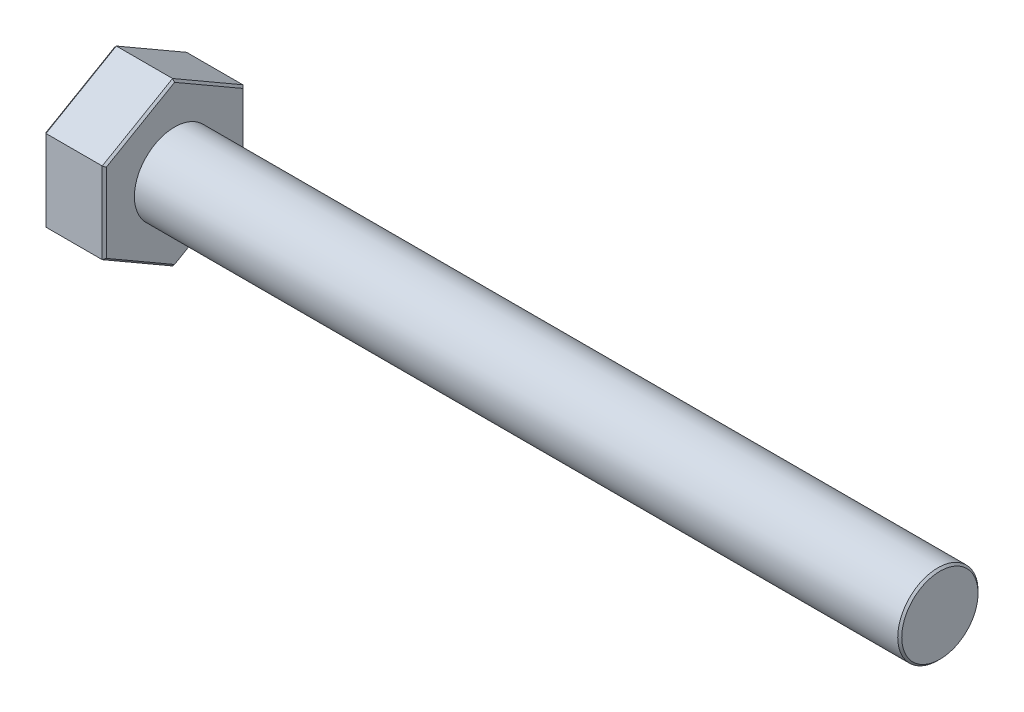
ISO-10303-21;
HEADER;
FILE_DESCRIPTION(('STEP AP214'),'2;1');
FILE_NAME('part.step','',(''),(''),'','','');
FILE_SCHEMA(('AUTOMOTIVE_DESIGN { 1 0 10303 214 1 1 1 1 }'));
ENDSEC;
DATA;
#1=APPLICATION_CONTEXT('core data for automotive mechanical design processes');
#2=APPLICATION_PROTOCOL_DEFINITION('international standard','automotive_design',2000,#1);
#3=PRODUCT_CONTEXT('',#1,'mechanical');
#4=PRODUCT('Part','Part','',(#3));
#5=PRODUCT_RELATED_PRODUCT_CATEGORY('part','',(#4));
#6=PRODUCT_DEFINITION_FORMATION('','',#4);
#7=PRODUCT_DEFINITION_CONTEXT('part definition',#1,'design');
#8=PRODUCT_DEFINITION('design','',#6,#7);
#9=PRODUCT_DEFINITION_SHAPE('','',#8);
#10=(LENGTH_UNIT() NAMED_UNIT(*) SI_UNIT(.MILLI.,.METRE.));
#11=(NAMED_UNIT(*) PLANE_ANGLE_UNIT() SI_UNIT($,.RADIAN.));
#12=(NAMED_UNIT(*) SI_UNIT($,.STERADIAN.) SOLID_ANGLE_UNIT());
#13=UNCERTAINTY_MEASURE_WITH_UNIT(LENGTH_MEASURE(1.E-05),#10,'distance_accuracy_value','');
#14=(GEOMETRIC_REPRESENTATION_CONTEXT(3) GLOBAL_UNCERTAINTY_ASSIGNED_CONTEXT((#13)) GLOBAL_UNIT_ASSIGNED_CONTEXT((#10,
#11,#12)) REPRESENTATION_CONTEXT('',''));
#15=CARTESIAN_POINT('',(0.,0.,0.));
#16=DIRECTION('',(0.,0.,1.));
#17=DIRECTION('',(1.,0.,0.));
#18=AXIS2_PLACEMENT_3D('',#15,#16,#17);
#19=CARTESIAN_POINT('',(-15.5546933939051,0.,0.));
#20=DIRECTION('',(-1.,0.,0.));
#21=DIRECTION('',(0.,0.,1.));
#22=AXIS2_PLACEMENT_3D('',#19,#20,#21);
#23=CYLINDRICAL_SURFACE('',#22,2.);
#24=CARTESIAN_POINT('',(38.,0.,0.));
#25=DIRECTION('',(-1.,0.,0.));
#26=DIRECTION('',(0.,0.,1.));
#27=AXIS2_PLACEMENT_3D('',#24,#25,#26);
#28=CIRCLE('',#27,2.);
#29=CARTESIAN_POINT('',(38.,0.,2.));
#30=VERTEX_POINT('',#29);
#31=EDGE_CURVE('E47',#30,#30,#28,.T.);
#32=ORIENTED_EDGE('',*,*,#31,.T.);
#33=EDGE_LOOP('',(#32));
#34=FACE_BOUND('',#33,.T.);
#35=CARTESIAN_POINT('',(0.,0.,0.));
#36=DIRECTION('',(-1.,0.,0.));
#37=DIRECTION('',(0.,0.,1.));
#38=AXIS2_PLACEMENT_3D('',#35,#36,#37);
#39=CIRCLE('',#38,2.);
#40=CARTESIAN_POINT('',(0.,0.,2.));
#41=VERTEX_POINT('',#40);
#42=EDGE_CURVE('E149',#41,#41,#39,.T.);
#43=ORIENTED_EDGE('',*,*,#42,.F.);
#44=EDGE_LOOP('',(#43));
#45=FACE_BOUND('',#44,.T.);
#46=ADVANCED_FACE('F39',(#34,#45),#23,.T.);
#47=CARTESIAN_POINT('',(38.1,2.,0.));
#48=DIRECTION('',(-1.,0.,0.));
#49=DIRECTION('',(0.,0.,1.));
#50=AXIS2_PLACEMENT_3D('',#47,#48,#49);
#51=PLANE('',#50);
#52=CARTESIAN_POINT('',(38.1,0.,0.));
#53=DIRECTION('',(-1.,0.,0.));
#54=DIRECTION('',(0.,0.,1.));
#55=AXIS2_PLACEMENT_3D('',#52,#53,#54);
#56=CIRCLE('',#55,1.9);
#57=CARTESIAN_POINT('',(38.1,0.,1.9));
#58=VERTEX_POINT('',#57);
#59=EDGE_CURVE('E11',#58,#58,#56,.F.);
#60=ORIENTED_EDGE('',*,*,#59,.T.);
#61=EDGE_LOOP('',(#60));
#62=FACE_BOUND('',#61,.T.);
#63=ADVANCED_FACE('F236',(#62),#51,.F.);
#64=CARTESIAN_POINT('',(0.,4.04145188432738,0.));
#65=DIRECTION('',(-1.,0.,0.));
#66=DIRECTION('',(0.,0.,1.));
#67=AXIS2_PLACEMENT_3D('',#64,#65,#66);
#68=PLANE('',#67);
#69=DIRECTION('',(0.,-0.5,-0.866025403784439));
#70=VECTOR('',#69,1.);
#71=CARTESIAN_POINT('',(0.,-1.93412340178525,3.45));
#72=LINE('',#71,#70);
#73=CARTESIAN_POINT('',(0.,-1.96299091524473,3.4));
#74=VERTEX_POINT('',#73);
#75=CARTESIAN_POINT('',(0.,-3.92598183048946,0.));
#76=VERTEX_POINT('',#75);
#77=EDGE_CURVE('E54',#74,#76,#72,.T.);
#78=ORIENTED_EDGE('',*,*,#77,.T.);
#79=DIRECTION('',(0.,0.5,-0.866025403784439));
#80=VECTOR('',#79,1.);
#81=CARTESIAN_POINT('',(0.,-1.93412340178525,-3.45));
#82=LINE('',#81,#80);
#83=CARTESIAN_POINT('',(0.,-1.96299091524473,-3.4));
#84=VERTEX_POINT('',#83);
#85=EDGE_CURVE('E192',#76,#84,#82,.T.);
#86=ORIENTED_EDGE('',*,*,#85,.T.);
#87=DIRECTION('',(0.,1.,0.));
#88=VECTOR('',#87,1.);
#89=CARTESIAN_POINT('',(0.,4.04145188432738,-3.4));
#90=LINE('',#89,#88);
#91=CARTESIAN_POINT('',(0.,1.96299091524473,-3.4));
#92=VERTEX_POINT('',#91);
#93=EDGE_CURVE('E184',#84,#92,#90,.T.);
#94=ORIENTED_EDGE('',*,*,#93,.T.);
#95=DIRECTION('',(0.,0.5,0.866025403784439));
#96=VECTOR('',#95,1.);
#97=CARTESIAN_POINT('',(0.,3.95484934394894,0.0500000000000007));
#98=LINE('',#97,#96);
#99=CARTESIAN_POINT('',(0.,3.92598183048946,0.));
#100=VERTEX_POINT('',#99);
#101=EDGE_CURVE('E186',#92,#100,#98,.T.);
#102=ORIENTED_EDGE('',*,*,#101,.T.);
#103=DIRECTION('',(0.,-0.5,0.866025403784439));
#104=VECTOR('',#103,1.);
#105=CARTESIAN_POINT('',(0.,3.95484934394894,-0.0499999999999992));
#106=LINE('',#105,#104);
#107=CARTESIAN_POINT('',(0.,1.96299091524473,3.4));
#108=VERTEX_POINT('',#107);
#109=EDGE_CURVE('E188',#100,#108,#106,.T.);
#110=ORIENTED_EDGE('',*,*,#109,.T.);
#111=DIRECTION('',(0.,-1.,0.));
#112=VECTOR('',#111,1.);
#113=CARTESIAN_POINT('',(0.,4.04145188432738,3.4));
#114=LINE('',#113,#112);
#115=EDGE_CURVE('E59',#108,#74,#114,.T.);
#116=ORIENTED_EDGE('',*,*,#115,.T.);
#117=EDGE_LOOP('',(#78,#86,#94,#102,#110,#116));
#118=FACE_BOUND('',#117,.T.);
#119=ORIENTED_EDGE('',*,*,#42,.T.);
#120=EDGE_LOOP('',(#119));
#121=FACE_BOUND('',#120,.T.);
#122=ADVANCED_FACE('F241',(#118,#121),#68,.F.);
#123=CARTESIAN_POINT('',(-3.,2.02072594216369,3.5));
#124=DIRECTION('',(0.,-0.866025403784439,-0.5));
#125=DIRECTION('',(0.,0.5,-0.866025403784439));
#126=AXIS2_PLACEMENT_3D('',#123,#124,#125);
#127=PLANE('',#126);
#128=DIRECTION('',(1.,0.,0.));
#129=VECTOR('',#128,1.);
#130=CARTESIAN_POINT('',(-3.,4.04145188432738,0.));
#131=LINE('',#130,#129);
#132=CARTESIAN_POINT('',(-2.90000000000001,4.04145188432738,0.));
#133=VERTEX_POINT('',#132);
#134=CARTESIAN_POINT('',(-0.099999999999999,4.04145188432738,0.));
#135=VERTEX_POINT('',#134);
#136=EDGE_CURVE('E316',#133,#135,#131,.T.);
#137=ORIENTED_EDGE('',*,*,#136,.F.);
#138=DIRECTION('',(0.,-0.5,0.866025403784439));
#139=VECTOR('',#138,1.);
#140=CARTESIAN_POINT('',(-2.90000000000001,2.02072594216369,3.5));
#141=LINE('',#140,#139);
#142=CARTESIAN_POINT('',(-2.90000000000001,2.02072594216369,3.5));
#143=VERTEX_POINT('',#142);
#144=EDGE_CURVE('E182',#133,#143,#141,.T.);
#145=ORIENTED_EDGE('',*,*,#144,.T.);
#146=DIRECTION('',(1.,0.,0.));
#147=VECTOR('',#146,1.);
#148=CARTESIAN_POINT('',(-3.,2.02072594216369,3.5));
#149=LINE('',#148,#147);
#150=CARTESIAN_POINT('',(-0.0999999999999994,2.02072594216369,3.5));
#151=VERTEX_POINT('',#150);
#152=EDGE_CURVE('E205',#143,#151,#149,.T.);
#153=ORIENTED_EDGE('',*,*,#152,.T.);
#154=DIRECTION('',(0.,0.5,-0.866025403784439));
#155=VECTOR('',#154,1.);
#156=CARTESIAN_POINT('',(-0.0999999999999994,2.02072594216369,3.5));
#157=LINE('',#156,#155);
#158=EDGE_CURVE('E180',#151,#135,#157,.T.);
#159=ORIENTED_EDGE('',*,*,#158,.T.);
#160=EDGE_LOOP('',(#137,#145,#153,#159));
#161=FACE_BOUND('',#160,.T.);
#162=ADVANCED_FACE('F344',(#161),#127,.F.);
#163=CARTESIAN_POINT('',(-3.,4.04145188432738,0.));
#164=DIRECTION('',(0.,-0.866025403784439,0.5));
#165=DIRECTION('',(0.,-0.5,-0.866025403784439));
#166=AXIS2_PLACEMENT_3D('',#163,#164,#165);
#167=PLANE('',#166);
#168=DIRECTION('',(1.,0.,0.));
#169=VECTOR('',#168,1.);
#170=CARTESIAN_POINT('',(-3.,2.02072594216369,-3.5));
#171=LINE('',#170,#169);
#172=CARTESIAN_POINT('',(-2.90000000000001,2.02072594216369,-3.5));
#173=VERTEX_POINT('',#172);
#174=CARTESIAN_POINT('',(-0.0999999999999994,2.02072594216369,-3.5));
#175=VERTEX_POINT('',#174);
#176=EDGE_CURVE('E308',#173,#175,#171,.T.);
#177=ORIENTED_EDGE('',*,*,#176,.F.);
#178=DIRECTION('',(0.,0.5,0.866025403784439));
#179=VECTOR('',#178,1.);
#180=CARTESIAN_POINT('',(-2.90000000000001,4.04145188432738,0.));
#181=LINE('',#180,#179);
#182=EDGE_CURVE('E178',#173,#133,#181,.T.);
#183=ORIENTED_EDGE('',*,*,#182,.T.);
#184=ORIENTED_EDGE('',*,*,#136,.T.);
#185=DIRECTION('',(0.,-0.5,-0.866025403784439));
#186=VECTOR('',#185,1.);
#187=CARTESIAN_POINT('',(-0.099999999999999,4.04145188432738,0.));
#188=LINE('',#187,#186);
#189=EDGE_CURVE('E176',#135,#175,#188,.T.);
#190=ORIENTED_EDGE('',*,*,#189,.T.);
#191=EDGE_LOOP('',(#177,#183,#184,#190));
#192=FACE_BOUND('',#191,.T.);
#193=ADVANCED_FACE('F348',(#192),#167,.F.);
#194=CARTESIAN_POINT('',(-3.,2.02072594216369,-3.5));
#195=DIRECTION('',(0.,0.,1.));
#196=DIRECTION('',(1.,0.,0.));
#197=AXIS2_PLACEMENT_3D('',#194,#195,#196);
#198=PLANE('',#197);
#199=DIRECTION('',(1.,0.,0.));
#200=VECTOR('',#199,1.);
#201=CARTESIAN_POINT('',(-3.,-2.02072594216369,-3.5));
#202=LINE('',#201,#200);
#203=CARTESIAN_POINT('',(-2.90000000000001,-2.02072594216369,-3.5));
#204=VERTEX_POINT('',#203);
#205=CARTESIAN_POINT('',(-0.0999999999999994,-2.02072594216369,-3.5));
#206=VERTEX_POINT('',#205);
#207=EDGE_CURVE('E305',#204,#206,#202,.T.);
#208=ORIENTED_EDGE('',*,*,#207,.F.);
#209=DIRECTION('',(0.,1.,0.));
#210=VECTOR('',#209,1.);
#211=CARTESIAN_POINT('',(-2.90000000000001,2.02072594216369,-3.5));
#212=LINE('',#211,#210);
#213=EDGE_CURVE('E174',#204,#173,#212,.T.);
#214=ORIENTED_EDGE('',*,*,#213,.T.);
#215=ORIENTED_EDGE('',*,*,#176,.T.);
#216=DIRECTION('',(0.,-1.,0.));
#217=VECTOR('',#216,1.);
#218=CARTESIAN_POINT('',(-0.0999999999999994,2.02072594216369,-3.5));
#219=LINE('',#218,#217);
#220=EDGE_CURVE('E172',#175,#206,#219,.T.);
#221=ORIENTED_EDGE('',*,*,#220,.T.);
#222=EDGE_LOOP('',(#208,#214,#215,#221));
#223=FACE_BOUND('',#222,.T.);
#224=ADVANCED_FACE('F304',(#223),#198,.F.);
#225=CARTESIAN_POINT('',(-3.,-2.02072594216369,-3.5));
#226=DIRECTION('',(0.,0.866025403784439,0.5));
#227=DIRECTION('',(0.,-0.5,0.866025403784439));
#228=AXIS2_PLACEMENT_3D('',#225,#226,#227);
#229=PLANE('',#228);
#230=DIRECTION('',(1.,0.,0.));
#231=VECTOR('',#230,1.);
#232=CARTESIAN_POINT('',(-3.,-4.04145188432738,0.));
#233=LINE('',#232,#231);
#234=CARTESIAN_POINT('',(-2.90000000000001,-4.04145188432738,0.));
#235=VERTEX_POINT('',#234);
#236=CARTESIAN_POINT('',(-0.0999999999999994,-4.04145188432738,0.));
#237=VERTEX_POINT('',#236);
#238=EDGE_CURVE('E314',#235,#237,#233,.T.);
#239=ORIENTED_EDGE('',*,*,#238,.F.);
#240=DIRECTION('',(0.,0.5,-0.866025403784439));
#241=VECTOR('',#240,1.);
#242=CARTESIAN_POINT('',(-2.90000000000001,-2.02072594216369,-3.5));
#243=LINE('',#242,#241);
#244=EDGE_CURVE('E170',#235,#204,#243,.T.);
#245=ORIENTED_EDGE('',*,*,#244,.T.);
#246=ORIENTED_EDGE('',*,*,#207,.T.);
#247=DIRECTION('',(0.,-0.5,0.866025403784439));
#248=VECTOR('',#247,1.);
#249=CARTESIAN_POINT('',(-0.0999999999999994,-2.02072594216369,-3.5));
#250=LINE('',#249,#248);
#251=EDGE_CURVE('E167',#206,#237,#250,.T.);
#252=ORIENTED_EDGE('',*,*,#251,.T.);
#253=EDGE_LOOP('',(#239,#245,#246,#252));
#254=FACE_BOUND('',#253,.T.);
#255=ADVANCED_FACE('F311',(#254),#229,.F.);
#256=CARTESIAN_POINT('',(-3.,-4.04145188432738,0.));
#257=DIRECTION('',(0.,0.866025403784439,-0.5));
#258=DIRECTION('',(0.,0.5,0.866025403784439));
#259=AXIS2_PLACEMENT_3D('',#256,#257,#258);
#260=PLANE('',#259);
#261=DIRECTION('',(1.,0.,0.));
#262=VECTOR('',#261,1.);
#263=CARTESIAN_POINT('',(-3.,-2.02072594216369,3.5));
#264=LINE('',#263,#262);
#265=CARTESIAN_POINT('',(-2.90000000000001,-2.02072594216369,3.5));
#266=VERTEX_POINT('',#265);
#267=CARTESIAN_POINT('',(-0.0999999999999994,-2.02072594216369,3.5));
#268=VERTEX_POINT('',#267);
#269=EDGE_CURVE('E318',#266,#268,#264,.T.);
#270=ORIENTED_EDGE('',*,*,#269,.F.);
#271=DIRECTION('',(0.,-0.5,-0.866025403784439));
#272=VECTOR('',#271,1.);
#273=CARTESIAN_POINT('',(-2.90000000000001,-4.04145188432738,0.));
#274=LINE('',#273,#272);
#275=EDGE_CURVE('E165',#266,#235,#274,.T.);
#276=ORIENTED_EDGE('',*,*,#275,.T.);
#277=ORIENTED_EDGE('',*,*,#238,.T.);
#278=DIRECTION('',(0.,0.5,0.866025403784439));
#279=VECTOR('',#278,1.);
#280=CARTESIAN_POINT('',(-0.0999999999999994,-4.04145188432738,0.));
#281=LINE('',#280,#279);
#282=EDGE_CURVE('E163',#237,#268,#281,.T.);
#283=ORIENTED_EDGE('',*,*,#282,.T.);
#284=EDGE_LOOP('',(#270,#276,#277,#283));
#285=FACE_BOUND('',#284,.T.);
#286=ADVANCED_FACE('F340',(#285),#260,.F.);
#287=CARTESIAN_POINT('',(-3.,-2.02072594216369,3.5));
#288=DIRECTION('',(0.,0.,-1.));
#289=DIRECTION('',(0.,1.,0.));
#290=AXIS2_PLACEMENT_3D('',#287,#288,#289);
#291=PLANE('',#290);
#292=ORIENTED_EDGE('',*,*,#152,.F.);
#293=DIRECTION('',(0.,-1.,0.));
#294=VECTOR('',#293,1.);
#295=CARTESIAN_POINT('',(-2.90000000000001,-2.02072594216369,3.5));
#296=LINE('',#295,#294);
#297=EDGE_CURVE('E135',#143,#266,#296,.T.);
#298=ORIENTED_EDGE('',*,*,#297,.T.);
#299=ORIENTED_EDGE('',*,*,#269,.T.);
#300=DIRECTION('',(0.,1.,0.));
#301=VECTOR('',#300,1.);
#302=CARTESIAN_POINT('',(-0.0999999999999994,-2.02072594216369,3.5));
#303=LINE('',#302,#301);
#304=EDGE_CURVE('E155',#268,#151,#303,.T.);
#305=ORIENTED_EDGE('',*,*,#304,.T.);
#306=EDGE_LOOP('',(#292,#298,#299,#305));
#307=FACE_BOUND('',#306,.T.);
#308=ADVANCED_FACE('F338',(#307),#291,.F.);
#309=CARTESIAN_POINT('',(-3.,4.04145188432738,0.));
#310=DIRECTION('',(-1.,0.,0.));
#311=DIRECTION('',(0.,0.,1.));
#312=AXIS2_PLACEMENT_3D('',#309,#310,#311);
#313=PLANE('',#312);
#314=DIRECTION('',(0.,0.5,0.866025403784439));
#315=VECTOR('',#314,1.);
#316=CARTESIAN_POINT('',(-3.,-1.93412340178525,3.45));
#317=LINE('',#316,#315);
#318=CARTESIAN_POINT('',(-3.,-3.92598183048946,0.));
#319=VERTEX_POINT('',#318);
#320=CARTESIAN_POINT('',(-3.,-1.96299091524473,3.40000000000001));
#321=VERTEX_POINT('',#320);
#322=EDGE_CURVE('E153',#319,#321,#317,.T.);
#323=ORIENTED_EDGE('',*,*,#322,.T.);
#324=DIRECTION('',(0.,1.,0.));
#325=VECTOR('',#324,1.);
#326=CARTESIAN_POINT('',(-3.,2.02072594216369,3.40000000000001));
#327=LINE('',#326,#325);
#328=CARTESIAN_POINT('',(-3.,1.96299091524473,3.40000000000001));
#329=VERTEX_POINT('',#328);
#330=EDGE_CURVE('E133',#321,#329,#327,.T.);
#331=ORIENTED_EDGE('',*,*,#330,.T.);
#332=DIRECTION('',(0.,0.5,-0.866025403784439));
#333=VECTOR('',#332,1.);
#334=CARTESIAN_POINT('',(-3.,3.95484934394894,-0.0499999999999963));
#335=LINE('',#334,#333);
#336=CARTESIAN_POINT('',(-3.,3.92598183048947,0.));
#337=VERTEX_POINT('',#336);
#338=EDGE_CURVE('E142',#329,#337,#335,.T.);
#339=ORIENTED_EDGE('',*,*,#338,.T.);
#340=DIRECTION('',(0.,-0.5,-0.866025403784439));
#341=VECTOR('',#340,1.);
#342=CARTESIAN_POINT('',(-3.,1.93412340178525,-3.45));
#343=LINE('',#342,#341);
#344=CARTESIAN_POINT('',(-3.,1.96299091524473,-3.40000000000001));
#345=VERTEX_POINT('',#344);
#346=EDGE_CURVE('E148',#337,#345,#343,.T.);
#347=ORIENTED_EDGE('',*,*,#346,.T.);
#348=DIRECTION('',(0.,-1.,0.));
#349=VECTOR('',#348,1.);
#350=CARTESIAN_POINT('',(-3.,-2.02072594216369,-3.40000000000001));
#351=LINE('',#350,#349);
#352=CARTESIAN_POINT('',(-3.,-1.96299091524473,-3.40000000000001));
#353=VERTEX_POINT('',#352);
#354=EDGE_CURVE('E327',#345,#353,#351,.T.);
#355=ORIENTED_EDGE('',*,*,#354,.T.);
#356=DIRECTION('',(0.,-0.5,0.866025403784439));
#357=VECTOR('',#356,1.);
#358=CARTESIAN_POINT('',(-3.,-3.95484934394894,0.0499999999999957));
#359=LINE('',#358,#357);
#360=EDGE_CURVE('E158',#353,#319,#359,.T.);
#361=ORIENTED_EDGE('',*,*,#360,.T.);
#362=EDGE_LOOP('',(#323,#331,#339,#347,#355,#361));
#363=FACE_BOUND('',#362,.T.);
#364=ADVANCED_FACE('F151',(#363),#313,.T.);
#365=CARTESIAN_POINT('',(-3.,4.04145188432738,-3.40000000000001));
#366=DIRECTION('',(-0.707106781186551,0.,-0.707106781186544));
#367=DIRECTION('',(-0.707106781186544,0.,0.707106781186551));
#368=AXIS2_PLACEMENT_3D('',#365,#366,#367);
#369=PLANE('',#368);
#370=DIRECTION('',(-0.654653670707975,-0.377964473009227,0.65465367070798));
#371=VECTOR('',#370,1.);
#372=CARTESIAN_POINT('',(-3.98571428571429,1.39388850704353,-2.41428571428571));
#373=LINE('',#372,#371);
#374=EDGE_CURVE('E199',#173,#345,#373,.T.);
#375=ORIENTED_EDGE('',*,*,#374,.F.);
#376=ORIENTED_EDGE('',*,*,#213,.F.);
#377=DIRECTION('',(-0.654653670707974,0.377964473009227,0.65465367070798));
#378=VECTOR('',#377,1.);
#379=CARTESIAN_POINT('',(-4.48571428571428,-1.10521337244871,-1.91428571428571));
#380=LINE('',#379,#378);
#381=EDGE_CURVE('E202',#353,#204,#380,.F.);
#382=ORIENTED_EDGE('',*,*,#381,.F.);
#383=ORIENTED_EDGE('',*,*,#354,.F.);
#384=EDGE_LOOP('',(#375,#376,#382,#383));
#385=FACE_BOUND('',#384,.T.);
#386=ADVANCED_FACE('F262',(#385),#369,.T.);
#387=CARTESIAN_POINT('',(-3.,-1.93412340178525,-3.45));
#388=DIRECTION('',(-0.70710678118655,-0.612372435695793,-0.353553390593273));
#389=DIRECTION('',(0.654653670707975,-0.755928946018457,0.));
#390=AXIS2_PLACEMENT_3D('',#387,#388,#389);
#391=PLANE('',#390);
#392=ORIENTED_EDGE('',*,*,#381,.T.);
#393=ORIENTED_EDGE('',*,*,#244,.F.);
#394=DIRECTION('',(-0.654653670707976,0.755928946018456,0.));
#395=VECTOR('',#394,1.);
#396=CARTESIAN_POINT('',(-3.98571428571428,-2.78777701408706,0.));
#397=LINE('',#396,#395);
#398=EDGE_CURVE('E196',#319,#235,#397,.F.);
#399=ORIENTED_EDGE('',*,*,#398,.F.);
#400=ORIENTED_EDGE('',*,*,#360,.F.);
#401=EDGE_LOOP('',(#392,#393,#399,#400));
#402=FACE_BOUND('',#401,.T.);
#403=ADVANCED_FACE('F258',(#402),#391,.T.);
#404=CARTESIAN_POINT('',(-3.,3.95484934394895,0.0499999999999977));
#405=DIRECTION('',(-0.70710678118655,0.612372435695793,-0.353553390593273));
#406=DIRECTION('',(-0.654653670707975,-0.755928946018456,0.));
#407=AXIS2_PLACEMENT_3D('',#404,#405,#406);
#408=PLANE('',#407);
#409=ORIENTED_EDGE('',*,*,#374,.T.);
#410=ORIENTED_EDGE('',*,*,#346,.F.);
#411=DIRECTION('',(-0.654653670707974,-0.755928946018457,0.));
#412=VECTOR('',#411,1.);
#413=CARTESIAN_POINT('',(-2.98571428571429,3.94247755246631,0.));
#414=LINE('',#413,#412);
#415=EDGE_CURVE('E145',#133,#337,#414,.T.);
#416=ORIENTED_EDGE('',*,*,#415,.F.);
#417=ORIENTED_EDGE('',*,*,#182,.F.);
#418=EDGE_LOOP('',(#409,#410,#416,#417));
#419=FACE_BOUND('',#418,.T.);
#420=ADVANCED_FACE('F254',(#419),#408,.T.);
#421=CARTESIAN_POINT('',(-3.,-1.93412340178525,3.45));
#422=DIRECTION('',(-0.707106781186548,-0.612372435695794,0.353553390593273));
#423=DIRECTION('',(0.654653670707976,-0.755928946018455,0.));
#424=AXIS2_PLACEMENT_3D('',#421,#422,#423);
#425=PLANE('',#424);
#426=ORIENTED_EDGE('',*,*,#398,.T.);
#427=ORIENTED_EDGE('',*,*,#275,.F.);
#428=DIRECTION('',(-0.654653670707975,0.377964473009224,-0.654653670707981));
#429=VECTOR('',#428,1.);
#430=CARTESIAN_POINT('',(-2.98571428571429,-1.97123877623316,3.41428571428572));
#431=LINE('',#430,#429);
#432=EDGE_CURVE('E138',#321,#266,#431,.F.);
#433=ORIENTED_EDGE('',*,*,#432,.F.);
#434=ORIENTED_EDGE('',*,*,#322,.F.);
#435=EDGE_LOOP('',(#426,#427,#433,#434));
#436=FACE_BOUND('',#435,.T.);
#437=ADVANCED_FACE('F251',(#436),#425,.T.);
#438=CARTESIAN_POINT('',(-3.,3.95484934394894,-0.049999999999996));
#439=DIRECTION('',(-0.707106781186551,0.612372435695791,0.353553390593272));
#440=DIRECTION('',(-0.654653670707973,-0.755928946018458,0.));
#441=AXIS2_PLACEMENT_3D('',#438,#439,#440);
#442=PLANE('',#441);
#443=ORIENTED_EDGE('',*,*,#415,.T.);
#444=ORIENTED_EDGE('',*,*,#338,.F.);
#445=DIRECTION('',(0.654653670707974,0.37796447300923,0.654653670707979));
#446=VECTOR('',#445,1.);
#447=CARTESIAN_POINT('',(-3.98571428571428,1.39388850704353,2.41428571428572));
#448=LINE('',#447,#446);
#449=EDGE_CURVE('E129',#143,#329,#448,.F.);
#450=ORIENTED_EDGE('',*,*,#449,.F.);
#451=ORIENTED_EDGE('',*,*,#144,.F.);
#452=EDGE_LOOP('',(#443,#444,#450,#451));
#453=FACE_BOUND('',#452,.T.);
#454=ADVANCED_FACE('F143',(#453),#442,.T.);
#455=CARTESIAN_POINT('',(-3.,4.04145188432738,3.4));
#456=DIRECTION('',(-0.707106781186551,0.,0.707106781186544));
#457=DIRECTION('',(0.707106781186544,0.,0.707106781186551));
#458=AXIS2_PLACEMENT_3D('',#455,#456,#457);
#459=PLANE('',#458);
#460=ORIENTED_EDGE('',*,*,#432,.T.);
#461=ORIENTED_EDGE('',*,*,#297,.F.);
#462=ORIENTED_EDGE('',*,*,#449,.T.);
#463=ORIENTED_EDGE('',*,*,#330,.F.);
#464=EDGE_LOOP('',(#460,#461,#462,#463));
#465=FACE_BOUND('',#464,.T.);
#466=ADVANCED_FACE('F131',(#465),#459,.T.);
#467=CARTESIAN_POINT('',(-0.0999999999999994,2.02072594216369,3.5));
#468=DIRECTION('',(-0.707106781186548,-0.612372435695794,-0.353553390593274));
#469=DIRECTION('',(0.654653670707976,-0.755928946018455,0.));
#470=AXIS2_PLACEMENT_3D('',#467,#468,#469);
#471=PLANE('',#470);
#472=DIRECTION('',(0.654653670707977,-0.377964473009229,-0.654653670707977));
#473=VECTOR('',#472,1.);
#474=CARTESIAN_POINT('',(-0.0999999999999994,2.02072594216369,3.5));
#475=LINE('',#474,#473);
#476=EDGE_CURVE('E216',#108,#151,#475,.F.);
#477=ORIENTED_EDGE('',*,*,#476,.F.);
#478=ORIENTED_EDGE('',*,*,#109,.F.);
#479=DIRECTION('',(0.654653670707977,-0.755928946018454,0.));
#480=VECTOR('',#479,1.);
#481=CARTESIAN_POINT('',(-0.0999999999999993,4.04145188432738,0.));
#482=LINE('',#481,#480);
#483=EDGE_CURVE('E139',#135,#100,#482,.T.);
#484=ORIENTED_EDGE('',*,*,#483,.F.);
#485=ORIENTED_EDGE('',*,*,#158,.F.);
#486=EDGE_LOOP('',(#477,#478,#484,#485));
#487=FACE_BOUND('',#486,.T.);
#488=ADVANCED_FACE('F248',(#487),#471,.F.);
#489=CARTESIAN_POINT('',(-0.0999999999999994,4.04145188432738,0.));
#490=DIRECTION('',(-0.707106781186546,-0.612372435695796,0.353553390593274));
#491=DIRECTION('',(0.654653670707979,-0.755928946018453,0.));
#492=AXIS2_PLACEMENT_3D('',#489,#490,#491);
#493=PLANE('',#492);
#494=ORIENTED_EDGE('',*,*,#483,.T.);
#495=ORIENTED_EDGE('',*,*,#101,.F.);
#496=DIRECTION('',(0.654653670707978,-0.377964473009225,0.654653670707978));
#497=VECTOR('',#496,1.);
#498=CARTESIAN_POINT('',(-0.0999999999999993,2.02072594216369,-3.5));
#499=LINE('',#498,#497);
#500=EDGE_CURVE('E213',#175,#92,#499,.T.);
#501=ORIENTED_EDGE('',*,*,#500,.F.);
#502=ORIENTED_EDGE('',*,*,#189,.F.);
#503=EDGE_LOOP('',(#494,#495,#501,#502));
#504=FACE_BOUND('',#503,.T.);
#505=ADVANCED_FACE('F277',(#504),#493,.F.);
#506=CARTESIAN_POINT('',(-0.0999999999999994,-2.02072594216369,3.5));
#507=DIRECTION('',(-0.707106781186548,0.,-0.707106781186548));
#508=DIRECTION('',(-0.707106781186548,0.,0.707106781186548));
#509=AXIS2_PLACEMENT_3D('',#506,#507,#508);
#510=PLANE('',#509);
#511=ORIENTED_EDGE('',*,*,#476,.T.);
#512=ORIENTED_EDGE('',*,*,#304,.F.);
#513=DIRECTION('',(0.654653670707978,0.377964473009223,-0.654653670707978));
#514=VECTOR('',#513,1.);
#515=CARTESIAN_POINT('',(-0.0999999999999996,-2.02072594216369,3.5));
#516=LINE('',#515,#514);
#517=EDGE_CURVE('E210',#74,#268,#516,.F.);
#518=ORIENTED_EDGE('',*,*,#517,.F.);
#519=ORIENTED_EDGE('',*,*,#115,.F.);
#520=EDGE_LOOP('',(#511,#512,#518,#519));
#521=FACE_BOUND('',#520,.T.);
#522=ADVANCED_FACE('F273',(#521),#510,.F.);
#523=CARTESIAN_POINT('',(-0.0999999999999994,2.02072594216369,-3.5));
#524=DIRECTION('',(-0.707106781186548,0.,0.707106781186548));
#525=DIRECTION('',(0.707106781186548,0.,0.707106781186548));
#526=AXIS2_PLACEMENT_3D('',#523,#524,#525);
#527=PLANE('',#526);
#528=ORIENTED_EDGE('',*,*,#500,.T.);
#529=ORIENTED_EDGE('',*,*,#93,.F.);
#530=DIRECTION('',(-0.654653670707976,-0.37796447300923,-0.654653670707976));
#531=VECTOR('',#530,1.);
#532=CARTESIAN_POINT('',(0.900000000000008,-1.44337567297406,-2.49999999999999));
#533=LINE('',#532,#531);
#534=EDGE_CURVE('E208',#206,#84,#533,.F.);
#535=ORIENTED_EDGE('',*,*,#534,.F.);
#536=ORIENTED_EDGE('',*,*,#220,.F.);
#537=EDGE_LOOP('',(#528,#529,#535,#536));
#538=FACE_BOUND('',#537,.T.);
#539=ADVANCED_FACE('F269',(#538),#527,.F.);
#540=CARTESIAN_POINT('',(-0.0999999999999994,-4.04145188432738,0.));
#541=DIRECTION('',(-0.707106781186545,0.612372435695797,-0.353553390593275));
#542=DIRECTION('',(-0.65465367070798,-0.755928946018452,0.));
#543=AXIS2_PLACEMENT_3D('',#540,#541,#542);
#544=PLANE('',#543);
#545=ORIENTED_EDGE('',*,*,#517,.T.);
#546=ORIENTED_EDGE('',*,*,#282,.F.);
#547=DIRECTION('',(0.654653670707978,0.755928946018454,0.));
#548=VECTOR('',#547,1.);
#549=CARTESIAN_POINT('',(-0.0999999999999994,-4.04145188432738,0.));
#550=LINE('',#549,#548);
#551=EDGE_CURVE('E206',#76,#237,#550,.F.);
#552=ORIENTED_EDGE('',*,*,#551,.F.);
#553=ORIENTED_EDGE('',*,*,#77,.F.);
#554=EDGE_LOOP('',(#545,#546,#552,#553));
#555=FACE_BOUND('',#554,.T.);
#556=ADVANCED_FACE('F231',(#555),#544,.F.);
#557=CARTESIAN_POINT('',(-0.0999999999999994,-2.02072594216369,-3.5));
#558=DIRECTION('',(-0.707106781186549,0.612372435695793,0.353553390593273));
#559=DIRECTION('',(-0.654653670707976,-0.755928946018456,0.));
#560=AXIS2_PLACEMENT_3D('',#557,#558,#559);
#561=PLANE('',#560);
#562=ORIENTED_EDGE('',*,*,#534,.T.);
#563=ORIENTED_EDGE('',*,*,#85,.F.);
#564=ORIENTED_EDGE('',*,*,#551,.T.);
#565=ORIENTED_EDGE('',*,*,#251,.F.);
#566=EDGE_LOOP('',(#562,#563,#564,#565));
#567=FACE_BOUND('',#566,.T.);
#568=ADVANCED_FACE('F226',(#567),#561,.F.);
#569=CARTESIAN_POINT('',(38.,0.,0.));
#570=DIRECTION('',(-1.,0.,0.));
#571=DIRECTION('',(0.,0.,1.));
#572=AXIS2_PLACEMENT_3D('',#569,#570,#571);
#573=CONICAL_SURFACE('',#572,2.,0.785398163397427);
#574=ORIENTED_EDGE('',*,*,#59,.F.);
#575=EDGE_LOOP('',(#574));
#576=FACE_BOUND('',#575,.T.);
#577=ORIENTED_EDGE('',*,*,#31,.F.);
#578=EDGE_LOOP('',(#577));
#579=FACE_BOUND('',#578,.T.);
#580=ADVANCED_FACE('F41',(#576,#579),#573,.T.);
#581=CLOSED_SHELL('',(#46,#63,#122,#162,#193,#224,#255,#286,#308,#364,#386,#403,#420,#437,#454,
#466,#488,#505,#522,#539,#556,#568,#580));
#582=MANIFOLD_SOLID_BREP('B2',#581);
#583=ADVANCED_BREP_SHAPE_REPRESENTATION('',(#18,#582),#14);
#584=SHAPE_DEFINITION_REPRESENTATION(#9,#583);
ENDSEC;
END-ISO-10303-21;
